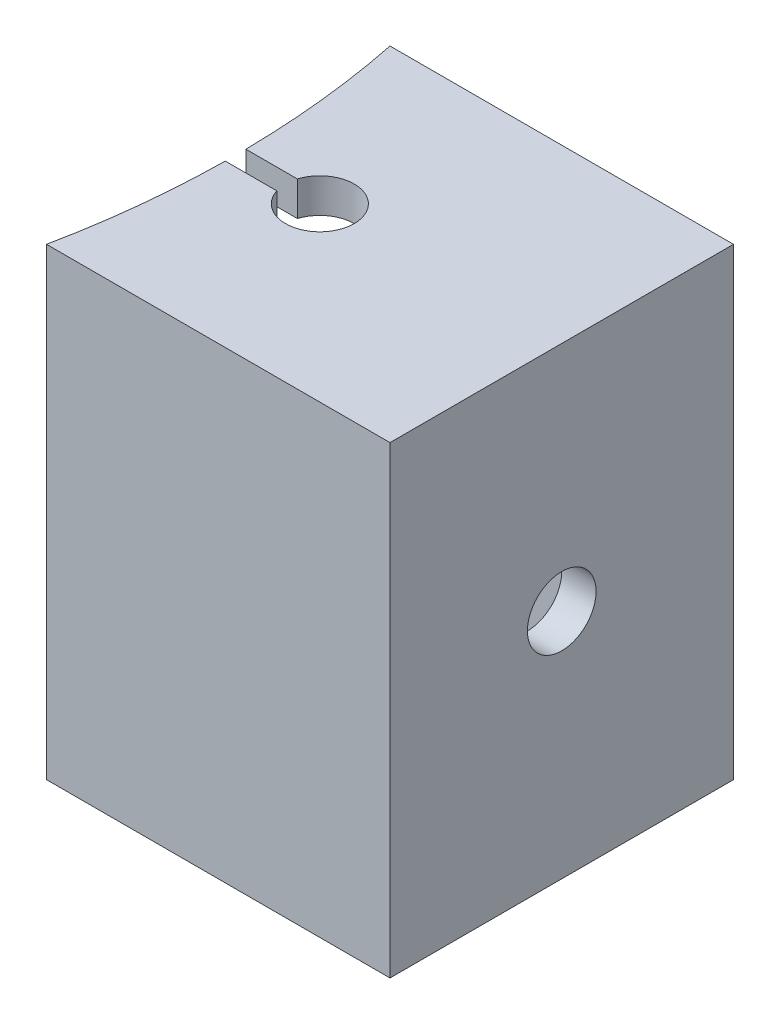
ISO-10303-21;
HEADER;
FILE_DESCRIPTION(('STEP AP214'),'2;1');
FILE_NAME('part.step','',(''),(''),'','','');
FILE_SCHEMA(('AUTOMOTIVE_DESIGN { 1 0 10303 214 1 1 1 1 }'));
ENDSEC;
DATA;
#1=APPLICATION_CONTEXT('core data for automotive mechanical design processes');
#2=APPLICATION_PROTOCOL_DEFINITION('international standard','automotive_design',2000,#1);
#3=PRODUCT_CONTEXT('',#1,'mechanical');
#4=PRODUCT('Part','Part','',(#3));
#5=PRODUCT_RELATED_PRODUCT_CATEGORY('part','',(#4));
#6=PRODUCT_DEFINITION_FORMATION('','',#4);
#7=PRODUCT_DEFINITION_CONTEXT('part definition',#1,'design');
#8=PRODUCT_DEFINITION('design','',#6,#7);
#9=PRODUCT_DEFINITION_SHAPE('','',#8);
#10=(LENGTH_UNIT() NAMED_UNIT(*) SI_UNIT(.MILLI.,.METRE.));
#11=(NAMED_UNIT(*) PLANE_ANGLE_UNIT() SI_UNIT($,.RADIAN.));
#12=(NAMED_UNIT(*) SI_UNIT($,.STERADIAN.) SOLID_ANGLE_UNIT());
#13=UNCERTAINTY_MEASURE_WITH_UNIT(LENGTH_MEASURE(1.E-05),#10,'distance_accuracy_value','');
#14=(GEOMETRIC_REPRESENTATION_CONTEXT(3) GLOBAL_UNCERTAINTY_ASSIGNED_CONTEXT((#13)) GLOBAL_UNIT_ASSIGNED_CONTEXT((#10,
#11,#12)) REPRESENTATION_CONTEXT('',''));
#15=CARTESIAN_POINT('',(0.,0.,0.));
#16=DIRECTION('',(0.,0.,1.));
#17=DIRECTION('',(1.,0.,0.));
#18=AXIS2_PLACEMENT_3D('',#15,#16,#17);
#19=CARTESIAN_POINT('',(-68.9897948556636,27.,-10.));
#20=DIRECTION('',(0.,-1.,0.));
#21=DIRECTION('',(0.,0.,-1.));
#22=AXIS2_PLACEMENT_3D('',#19,#20,#21);
#23=CYLINDRICAL_SURFACE('',#22,50.);
#24=CARTESIAN_POINT('',(-68.9897948556636,2.,-10.));
#25=DIRECTION('',(0.,-1.,0.));
#26=DIRECTION('',(0.,0.,-1.));
#27=AXIS2_PLACEMENT_3D('',#24,#25,#26);
#28=CIRCLE('',#27,50.);
#29=CARTESIAN_POINT('',(-19.6339441386513,2.,-18.));
#30=VERTEX_POINT('',#29);
#31=CARTESIAN_POINT('',(-18.9933961040139,2.,-10.6000932144618));
#32=VERTEX_POINT('',#31);
#33=EDGE_CURVE('E206',#30,#32,#28,.T.);
#34=ORIENTED_EDGE('',*,*,#33,.F.);
#35=DIRECTION('',(0.,-1.,0.));
#36=VECTOR('',#35,1.);
#37=CARTESIAN_POINT('',(-19.6339441386513,25.,-18.));
#38=LINE('',#37,#36);
#39=CARTESIAN_POINT('',(-19.6339441386513,25.,-18.));
#40=VERTEX_POINT('',#39);
#41=EDGE_CURVE('E278',#40,#30,#38,.T.);
#42=ORIENTED_EDGE('',*,*,#41,.F.);
#43=CARTESIAN_POINT('',(-68.9897948556636,25.,-10.));
#44=DIRECTION('',(0.,-1.,0.));
#45=DIRECTION('',(0.,0.,-1.));
#46=AXIS2_PLACEMENT_3D('',#43,#44,#45);
#47=CIRCLE('',#46,50.);
#48=CARTESIAN_POINT('',(-18.9933961040139,25.,-10.6000932144618));
#49=VERTEX_POINT('',#48);
#50=EDGE_CURVE('E269',#40,#49,#47,.T.);
#51=ORIENTED_EDGE('',*,*,#50,.T.);
#52=DIRECTION('',(0.,-1.,0.));
#53=VECTOR('',#52,1.);
#54=CARTESIAN_POINT('',(-18.9933961040139,27.,-10.6000932144618));
#55=LINE('',#54,#53);
#56=CARTESIAN_POINT('',(-18.9933961040139,27.,-10.6000932144618));
#57=VERTEX_POINT('',#56);
#58=EDGE_CURVE('E179',#57,#49,#55,.T.);
#59=ORIENTED_EDGE('',*,*,#58,.F.);
#60=CARTESIAN_POINT('',(-68.9897948556636,27.,-10.));
#61=DIRECTION('',(0.,-1.,0.));
#62=DIRECTION('',(0.,0.,-1.));
#63=AXIS2_PLACEMENT_3D('',#60,#61,#62);
#64=CIRCLE('',#63,50.);
#65=CARTESIAN_POINT('',(-20.,27.,-20.));
#66=VERTEX_POINT('',#65);
#67=EDGE_CURVE('E189',#66,#57,#64,.T.);
#68=ORIENTED_EDGE('',*,*,#67,.F.);
#69=DIRECTION('',(0.,-1.,0.));
#70=VECTOR('',#69,1.);
#71=CARTESIAN_POINT('',(-20.,27.,-20.));
#72=LINE('',#71,#70);
#73=CARTESIAN_POINT('',(-20.,0.,-20.));
#74=VERTEX_POINT('',#73);
#75=EDGE_CURVE('E43',#66,#74,#72,.T.);
#76=ORIENTED_EDGE('',*,*,#75,.T.);
#77=CARTESIAN_POINT('',(-68.9897948556636,0.,-10.));
#78=DIRECTION('',(0.,-1.,0.));
#79=DIRECTION('',(0.,0.,-1.));
#80=AXIS2_PLACEMENT_3D('',#77,#78,#79);
#81=CIRCLE('',#80,50.);
#82=CARTESIAN_POINT('',(-18.9933961040139,0.,-10.6000932144618));
#83=VERTEX_POINT('',#82);
#84=EDGE_CURVE('E154',#74,#83,#81,.T.);
#85=ORIENTED_EDGE('',*,*,#84,.T.);
#86=EDGE_CURVE('E178',#32,#83,#55,.T.);
#87=ORIENTED_EDGE('',*,*,#86,.F.);
#88=EDGE_LOOP('',(#34,#42,#51,#59,#68,#76,#85,#87));
#89=FACE_BOUND('',#88,.T.);
#90=ADVANCED_FACE('F35',(#89),#23,.F.);
#91=CARTESIAN_POINT('',(-18.9933961040139,27.,-10.6000932144618));
#92=DIRECTION('',(0.,0.,-1.));
#93=DIRECTION('',(-1.,0.,0.));
#94=AXIS2_PLACEMENT_3D('',#91,#92,#93);
#95=PLANE('',#94);
#96=DIRECTION('',(1.,0.,0.));
#97=VECTOR('',#96,1.);
#98=CARTESIAN_POINT('',(-68.9897948556636,2.,-10.6000932144618));
#99=LINE('',#98,#97);
#100=CARTESIAN_POINT('',(-15.9933961040139,2.,-10.6000932144618));
#101=VERTEX_POINT('',#100);
#102=EDGE_CURVE('E202',#32,#101,#99,.T.);
#103=ORIENTED_EDGE('',*,*,#102,.F.);
#104=ORIENTED_EDGE('',*,*,#86,.T.);
#105=DIRECTION('',(1.,0.,0.));
#106=VECTOR('',#105,1.);
#107=CARTESIAN_POINT('',(-18.9933961040139,0.,-10.6000932144618));
#108=LINE('',#107,#106);
#109=CARTESIAN_POINT('',(-15.9933961040139,0.,-10.6000932144618));
#110=VERTEX_POINT('',#109);
#111=EDGE_CURVE('E157',#83,#110,#108,.T.);
#112=ORIENTED_EDGE('',*,*,#111,.T.);
#113=DIRECTION('',(0.,-1.,0.));
#114=VECTOR('',#113,1.);
#115=CARTESIAN_POINT('',(-15.9933961040139,27.,-10.6000932144618));
#116=LINE('',#115,#114);
#117=EDGE_CURVE('E174',#101,#110,#116,.T.);
#118=ORIENTED_EDGE('',*,*,#117,.F.);
#119=EDGE_LOOP('',(#103,#104,#112,#118));
#120=FACE_BOUND('',#119,.T.);
#121=ADVANCED_FACE('F198',(#120),#95,.F.);
#122=CARTESIAN_POINT('',(-14.0855165825296,27.,-10.0000967715551));
#123=DIRECTION('',(0.,-1.,0.));
#124=DIRECTION('',(0.,0.,-1.));
#125=AXIS2_PLACEMENT_3D('',#122,#123,#124);
#126=CYLINDRICAL_SURFACE('',#125,2.);
#127=CARTESIAN_POINT('',(-14.0855165825296,2.,-10.0000967715551));
#128=DIRECTION('',(0.,-1.,0.));
#129=DIRECTION('',(0.,0.,-1.));
#130=AXIS2_PLACEMENT_3D('',#127,#128,#129);
#131=CIRCLE('',#130,2.);
#132=CARTESIAN_POINT('',(-15.9933938667057,2.,-9.40009321446183));
#133=VERTEX_POINT('',#132);
#134=EDGE_CURVE('E282',#101,#133,#131,.T.);
#135=ORIENTED_EDGE('',*,*,#134,.F.);
#136=ORIENTED_EDGE('',*,*,#117,.T.);
#137=CARTESIAN_POINT('',(-14.0855165825296,0.,-10.0000967715551));
#138=DIRECTION('',(0.,-1.,0.));
#139=DIRECTION('',(0.,0.,-1.));
#140=AXIS2_PLACEMENT_3D('',#137,#138,#139);
#141=CIRCLE('',#140,2.);
#142=CARTESIAN_POINT('',(-15.9933938667057,0.,-9.40009321446183));
#143=VERTEX_POINT('',#142);
#144=EDGE_CURVE('E160',#110,#143,#141,.T.);
#145=ORIENTED_EDGE('',*,*,#144,.T.);
#146=DIRECTION('',(0.,-1.,0.));
#147=VECTOR('',#146,1.);
#148=CARTESIAN_POINT('',(-15.9933938667057,27.,-9.40009321446183));
#149=LINE('',#148,#147);
#150=EDGE_CURVE('E137',#133,#143,#149,.T.);
#151=ORIENTED_EDGE('',*,*,#150,.F.);
#152=EDGE_LOOP('',(#135,#136,#145,#151));
#153=FACE_BOUND('',#152,.T.);
#154=ADVANCED_FACE('F328',(#153),#126,.F.);
#155=CARTESIAN_POINT('',(-18.9933938667057,27.,-9.40009321446182));
#156=DIRECTION('',(0.,0.,1.));
#157=DIRECTION('',(1.,0.,0.));
#158=AXIS2_PLACEMENT_3D('',#155,#156,#157);
#159=PLANE('',#158);
#160=DIRECTION('',(-1.,0.,0.));
#161=VECTOR('',#160,1.);
#162=CARTESIAN_POINT('',(-68.9897948556636,2.,-9.4000932144618));
#163=LINE('',#162,#161);
#164=CARTESIAN_POINT('',(-18.9933938667057,2.,-9.40009321446182));
#165=VERTEX_POINT('',#164);
#166=EDGE_CURVE('E284',#133,#165,#163,.T.);
#167=ORIENTED_EDGE('',*,*,#166,.F.);
#168=ORIENTED_EDGE('',*,*,#150,.T.);
#169=DIRECTION('',(-1.,0.,0.));
#170=VECTOR('',#169,1.);
#171=CARTESIAN_POINT('',(-18.9933938667057,0.,-9.40009321446182));
#172=LINE('',#171,#170);
#173=CARTESIAN_POINT('',(-18.9933938667057,0.,-9.40009321446182));
#174=VERTEX_POINT('',#173);
#175=EDGE_CURVE('E163',#143,#174,#172,.T.);
#176=ORIENTED_EDGE('',*,*,#175,.T.);
#177=DIRECTION('',(0.,-1.,0.));
#178=VECTOR('',#177,1.);
#179=CARTESIAN_POINT('',(-18.9933938667057,27.,-9.40009321446182));
#180=LINE('',#179,#178);
#181=EDGE_CURVE('E138',#165,#174,#180,.T.);
#182=ORIENTED_EDGE('',*,*,#181,.F.);
#183=EDGE_LOOP('',(#167,#168,#176,#182));
#184=FACE_BOUND('',#183,.T.);
#185=ADVANCED_FACE('F308',(#184),#159,.F.);
#186=CARTESIAN_POINT('',(-68.9897948556636,27.,-10.));
#187=DIRECTION('',(0.,-1.,0.));
#188=DIRECTION('',(0.,0.,-1.));
#189=AXIS2_PLACEMENT_3D('',#186,#187,#188);
#190=CYLINDRICAL_SURFACE('',#189,50.);
#191=CARTESIAN_POINT('',(-68.9897948556636,2.,-10.));
#192=DIRECTION('',(0.,-1.,0.));
#193=DIRECTION('',(0.,0.,-1.));
#194=AXIS2_PLACEMENT_3D('',#191,#192,#193);
#195=CIRCLE('',#194,50.);
#196=CARTESIAN_POINT('',(-19.6339441386513,2.,-2.));
#197=VERTEX_POINT('',#196);
#198=EDGE_CURVE('E271',#165,#197,#195,.T.);
#199=ORIENTED_EDGE('',*,*,#198,.F.);
#200=ORIENTED_EDGE('',*,*,#181,.T.);
#201=CARTESIAN_POINT('',(-68.9897948556636,0.,-10.));
#202=DIRECTION('',(0.,-1.,0.));
#203=DIRECTION('',(0.,0.,-1.));
#204=AXIS2_PLACEMENT_3D('',#201,#202,#203);
#205=CIRCLE('',#204,50.);
#206=CARTESIAN_POINT('',(-20.,0.,0.));
#207=VERTEX_POINT('',#206);
#208=EDGE_CURVE('E166',#174,#207,#205,.T.);
#209=ORIENTED_EDGE('',*,*,#208,.T.);
#210=DIRECTION('',(0.,-1.,0.));
#211=VECTOR('',#210,1.);
#212=CARTESIAN_POINT('',(-20.,27.,0.));
#213=LINE('',#212,#211);
#214=CARTESIAN_POINT('',(-20.,27.,0.));
#215=VERTEX_POINT('',#214);
#216=EDGE_CURVE('E142',#215,#207,#213,.T.);
#217=ORIENTED_EDGE('',*,*,#216,.F.);
#218=CARTESIAN_POINT('',(-68.9897948556636,27.,-10.));
#219=DIRECTION('',(0.,-1.,0.));
#220=DIRECTION('',(0.,0.,-1.));
#221=AXIS2_PLACEMENT_3D('',#218,#219,#220);
#222=CIRCLE('',#221,50.);
#223=CARTESIAN_POINT('',(-18.9933938667057,27.,-9.40009321446182));
#224=VERTEX_POINT('',#223);
#225=EDGE_CURVE('E120',#224,#215,#222,.T.);
#226=ORIENTED_EDGE('',*,*,#225,.F.);
#227=CARTESIAN_POINT('',(-18.9933938667057,25.,-9.40009321446182));
#228=VERTEX_POINT('',#227);
#229=EDGE_CURVE('E130',#224,#228,#180,.T.);
#230=ORIENTED_EDGE('',*,*,#229,.T.);
#231=CARTESIAN_POINT('',(-68.9897948556636,25.,-10.));
#232=DIRECTION('',(0.,-1.,0.));
#233=DIRECTION('',(0.,0.,-1.));
#234=AXIS2_PLACEMENT_3D('',#231,#232,#233);
#235=CIRCLE('',#234,50.);
#236=CARTESIAN_POINT('',(-19.6339441386513,25.,-2.));
#237=VERTEX_POINT('',#236);
#238=EDGE_CURVE('E257',#228,#237,#235,.T.);
#239=ORIENTED_EDGE('',*,*,#238,.T.);
#240=DIRECTION('',(0.,-1.,0.));
#241=VECTOR('',#240,1.);
#242=CARTESIAN_POINT('',(-19.6339441386513,25.,-2.));
#243=LINE('',#242,#241);
#244=EDGE_CURVE('E256',#237,#197,#243,.T.);
#245=ORIENTED_EDGE('',*,*,#244,.T.);
#246=EDGE_LOOP('',(#199,#200,#209,#217,#226,#230,#239,#245));
#247=FACE_BOUND('',#246,.T.);
#248=ADVANCED_FACE('F141',(#247),#190,.F.);
#249=CARTESIAN_POINT('',(0.,27.,0.));
#250=DIRECTION('',(-1.,0.,0.));
#251=DIRECTION('',(0.,0.,1.));
#252=AXIS2_PLACEMENT_3D('',#249,#250,#251);
#253=PLANE('',#252);
#254=CARTESIAN_POINT('',(0.,13.5,-10.));
#255=DIRECTION('',(1.,0.,0.));
#256=DIRECTION('',(0.,0.,-1.));
#257=AXIS2_PLACEMENT_3D('',#254,#255,#256);
#258=CIRCLE('',#257,2.);
#259=CARTESIAN_POINT('',(0.,13.5,-12.));
#260=VERTEX_POINT('',#259);
#261=EDGE_CURVE('E366',#260,#260,#258,.T.);
#262=ORIENTED_EDGE('',*,*,#261,.F.);
#263=EDGE_LOOP('',(#262));
#264=FACE_BOUND('',#263,.T.);
#265=DIRECTION('',(0.,0.,-1.));
#266=VECTOR('',#265,1.);
#267=CARTESIAN_POINT('',(0.,0.,0.));
#268=LINE('',#267,#266);
#269=CARTESIAN_POINT('',(0.,0.,0.));
#270=VERTEX_POINT('',#269);
#271=CARTESIAN_POINT('',(0.,0.,-20.));
#272=VERTEX_POINT('',#271);
#273=EDGE_CURVE('E148',#270,#272,#268,.T.);
#274=ORIENTED_EDGE('',*,*,#273,.T.);
#275=DIRECTION('',(0.,-1.,0.));
#276=VECTOR('',#275,1.);
#277=CARTESIAN_POINT('',(0.,27.,-20.));
#278=LINE('',#277,#276);
#279=CARTESIAN_POINT('',(0.,27.,-20.));
#280=VERTEX_POINT('',#279);
#281=EDGE_CURVE('E11',#280,#272,#278,.T.);
#282=ORIENTED_EDGE('',*,*,#281,.F.);
#283=DIRECTION('',(0.,0.,-1.));
#284=VECTOR('',#283,1.);
#285=CARTESIAN_POINT('',(0.,27.,0.));
#286=LINE('',#285,#284);
#287=CARTESIAN_POINT('',(0.,27.,0.));
#288=VERTEX_POINT('',#287);
#289=EDGE_CURVE('E169',#288,#280,#286,.T.);
#290=ORIENTED_EDGE('',*,*,#289,.F.);
#291=DIRECTION('',(0.,-1.,0.));
#292=VECTOR('',#291,1.);
#293=CARTESIAN_POINT('',(0.,27.,0.));
#294=LINE('',#293,#292);
#295=EDGE_CURVE('E144',#288,#270,#294,.T.);
#296=ORIENTED_EDGE('',*,*,#295,.T.);
#297=EDGE_LOOP('',(#274,#282,#290,#296));
#298=FACE_BOUND('',#297,.T.);
#299=ADVANCED_FACE('F37',(#264,#298),#253,.F.);
#300=CARTESIAN_POINT('',(0.,27.,-20.));
#301=DIRECTION('',(0.,0.,1.));
#302=DIRECTION('',(1.,0.,0.));
#303=AXIS2_PLACEMENT_3D('',#300,#301,#302);
#304=PLANE('',#303);
#305=DIRECTION('',(-1.,0.,0.));
#306=VECTOR('',#305,1.);
#307=CARTESIAN_POINT('',(0.,0.,-20.));
#308=LINE('',#307,#306);
#309=EDGE_CURVE('E151',#272,#74,#308,.T.);
#310=ORIENTED_EDGE('',*,*,#309,.T.);
#311=ORIENTED_EDGE('',*,*,#75,.F.);
#312=DIRECTION('',(-1.,0.,0.));
#313=VECTOR('',#312,1.);
#314=CARTESIAN_POINT('',(0.,27.,-20.));
#315=LINE('',#314,#313);
#316=EDGE_CURVE('E100',#280,#66,#315,.T.);
#317=ORIENTED_EDGE('',*,*,#316,.F.);
#318=ORIENTED_EDGE('',*,*,#281,.T.);
#319=EDGE_LOOP('',(#310,#311,#317,#318));
#320=FACE_BOUND('',#319,.T.);
#321=ADVANCED_FACE('F315',(#320),#304,.F.);
#322=ORIENTED_EDGE('',*,*,#58,.T.);
#323=DIRECTION('',(1.,0.,0.));
#324=VECTOR('',#323,1.);
#325=CARTESIAN_POINT('',(-68.9897948556636,25.,-10.6000932144618));
#326=LINE('',#325,#324);
#327=CARTESIAN_POINT('',(-15.9933961040139,25.,-10.6000932144618));
#328=VERTEX_POINT('',#327);
#329=EDGE_CURVE('E234',#49,#328,#326,.T.);
#330=ORIENTED_EDGE('',*,*,#329,.T.);
#331=CARTESIAN_POINT('',(-15.9933961040139,27.,-10.6000932144618));
#332=VERTEX_POINT('',#331);
#333=EDGE_CURVE('E175',#332,#328,#116,.T.);
#334=ORIENTED_EDGE('',*,*,#333,.F.);
#335=DIRECTION('',(1.,0.,0.));
#336=VECTOR('',#335,1.);
#337=CARTESIAN_POINT('',(-18.9933961040139,27.,-10.6000932144618));
#338=LINE('',#337,#336);
#339=EDGE_CURVE('E298',#57,#332,#338,.T.);
#340=ORIENTED_EDGE('',*,*,#339,.F.);
#341=EDGE_LOOP('',(#322,#330,#334,#340));
#342=FACE_BOUND('',#341,.T.);
#343=ADVANCED_FACE('F302',(#342),#95,.F.);
#344=ORIENTED_EDGE('',*,*,#333,.T.);
#345=CARTESIAN_POINT('',(-14.0855165825296,25.,-10.0000967715551));
#346=DIRECTION('',(0.,-1.,0.));
#347=DIRECTION('',(0.,0.,-1.));
#348=AXIS2_PLACEMENT_3D('',#345,#346,#347);
#349=CIRCLE('',#348,2.);
#350=CARTESIAN_POINT('',(-15.9933938667057,25.,-9.40009321446183));
#351=VERTEX_POINT('',#350);
#352=EDGE_CURVE('E290',#328,#351,#349,.T.);
#353=ORIENTED_EDGE('',*,*,#352,.T.);
#354=CARTESIAN_POINT('',(-15.9933938667057,27.,-9.40009321446183));
#355=VERTEX_POINT('',#354);
#356=EDGE_CURVE('E172',#355,#351,#149,.T.);
#357=ORIENTED_EDGE('',*,*,#356,.F.);
#358=CARTESIAN_POINT('',(-14.0855165825296,27.,-10.0000967715551));
#359=DIRECTION('',(0.,-1.,0.));
#360=DIRECTION('',(0.,0.,-1.));
#361=AXIS2_PLACEMENT_3D('',#358,#359,#360);
#362=CIRCLE('',#361,2.);
#363=EDGE_CURVE('E123',#332,#355,#362,.T.);
#364=ORIENTED_EDGE('',*,*,#363,.F.);
#365=EDGE_LOOP('',(#344,#353,#357,#364));
#366=FACE_BOUND('',#365,.T.);
#367=ADVANCED_FACE('F304',(#366),#126,.F.);
#368=ORIENTED_EDGE('',*,*,#356,.T.);
#369=DIRECTION('',(-1.,0.,0.));
#370=VECTOR('',#369,1.);
#371=CARTESIAN_POINT('',(-68.9897948556636,25.,-9.4000932144618));
#372=LINE('',#371,#370);
#373=EDGE_CURVE('E134',#351,#228,#372,.T.);
#374=ORIENTED_EDGE('',*,*,#373,.T.);
#375=ORIENTED_EDGE('',*,*,#229,.F.);
#376=DIRECTION('',(-1.,0.,0.));
#377=VECTOR('',#376,1.);
#378=CARTESIAN_POINT('',(-18.9933938667057,27.,-9.40009321446182));
#379=LINE('',#378,#377);
#380=EDGE_CURVE('E116',#355,#224,#379,.T.);
#381=ORIENTED_EDGE('',*,*,#380,.F.);
#382=EDGE_LOOP('',(#368,#374,#375,#381));
#383=FACE_BOUND('',#382,.T.);
#384=ADVANCED_FACE('F131',(#383),#159,.F.);
#385=CARTESIAN_POINT('',(0.,27.,0.));
#386=DIRECTION('',(0.,0.,-1.));
#387=DIRECTION('',(-1.,0.,0.));
#388=AXIS2_PLACEMENT_3D('',#385,#386,#387);
#389=PLANE('',#388);
#390=DIRECTION('',(1.,0.,0.));
#391=VECTOR('',#390,1.);
#392=CARTESIAN_POINT('',(0.,0.,0.));
#393=LINE('',#392,#391);
#394=EDGE_CURVE('E92',#207,#270,#393,.T.);
#395=ORIENTED_EDGE('',*,*,#394,.T.);
#396=ORIENTED_EDGE('',*,*,#295,.F.);
#397=DIRECTION('',(1.,0.,0.));
#398=VECTOR('',#397,1.);
#399=CARTESIAN_POINT('',(0.,27.,0.));
#400=LINE('',#399,#398);
#401=EDGE_CURVE('E59',#215,#288,#400,.T.);
#402=ORIENTED_EDGE('',*,*,#401,.F.);
#403=ORIENTED_EDGE('',*,*,#216,.T.);
#404=EDGE_LOOP('',(#395,#396,#402,#403));
#405=FACE_BOUND('',#404,.T.);
#406=ADVANCED_FACE('F311',(#405),#389,.F.);
#407=CARTESIAN_POINT('',(-68.9897948556636,27.,-10.));
#408=DIRECTION('',(0.,-1.,0.));
#409=DIRECTION('',(0.,0.,-1.));
#410=AXIS2_PLACEMENT_3D('',#407,#408,#409);
#411=PLANE('',#410);
#412=ORIENTED_EDGE('',*,*,#289,.T.);
#413=ORIENTED_EDGE('',*,*,#316,.T.);
#414=ORIENTED_EDGE('',*,*,#67,.T.);
#415=ORIENTED_EDGE('',*,*,#339,.T.);
#416=ORIENTED_EDGE('',*,*,#363,.T.);
#417=ORIENTED_EDGE('',*,*,#380,.T.);
#418=ORIENTED_EDGE('',*,*,#225,.T.);
#419=ORIENTED_EDGE('',*,*,#401,.T.);
#420=EDGE_LOOP('',(#412,#413,#414,#415,#416,#417,#418,#419));
#421=FACE_BOUND('',#420,.T.);
#422=ADVANCED_FACE('F118',(#421),#411,.F.);
#423=CARTESIAN_POINT('',(-68.9897948556636,0.,-10.));
#424=DIRECTION('',(0.,-1.,0.));
#425=DIRECTION('',(0.,0.,-1.));
#426=AXIS2_PLACEMENT_3D('',#423,#424,#425);
#427=PLANE('',#426);
#428=ORIENTED_EDGE('',*,*,#273,.F.);
#429=ORIENTED_EDGE('',*,*,#394,.F.);
#430=ORIENTED_EDGE('',*,*,#208,.F.);
#431=ORIENTED_EDGE('',*,*,#175,.F.);
#432=ORIENTED_EDGE('',*,*,#144,.F.);
#433=ORIENTED_EDGE('',*,*,#111,.F.);
#434=ORIENTED_EDGE('',*,*,#84,.F.);
#435=ORIENTED_EDGE('',*,*,#309,.F.);
#436=EDGE_LOOP('',(#428,#429,#430,#431,#432,#433,#434,#435));
#437=FACE_BOUND('',#436,.T.);
#438=ADVANCED_FACE('F192',(#437),#427,.T.);
#439=CARTESIAN_POINT('',(-2.,27.,0.));
#440=DIRECTION('',(-1.,0.,0.));
#441=DIRECTION('',(0.,0.,1.));
#442=AXIS2_PLACEMENT_3D('',#439,#440,#441);
#443=PLANE('',#442);
#444=CARTESIAN_POINT('',(-2.,13.5,-10.));
#445=DIRECTION('',(1.,0.,0.));
#446=DIRECTION('',(0.,0.,-1.));
#447=AXIS2_PLACEMENT_3D('',#444,#445,#446);
#448=CIRCLE('',#447,2.);
#449=CARTESIAN_POINT('',(-2.,13.5,-12.));
#450=VERTEX_POINT('',#449);
#451=EDGE_CURVE('E363',#450,#450,#448,.T.);
#452=ORIENTED_EDGE('',*,*,#451,.T.);
#453=EDGE_LOOP('',(#452));
#454=FACE_BOUND('',#453,.T.);
#455=DIRECTION('',(0.,0.,-1.));
#456=VECTOR('',#455,1.);
#457=CARTESIAN_POINT('',(-2.,2.,-10.));
#458=LINE('',#457,#456);
#459=CARTESIAN_POINT('',(-2.,2.,-2.));
#460=VERTEX_POINT('',#459);
#461=CARTESIAN_POINT('',(-2.,2.,-18.));
#462=VERTEX_POINT('',#461);
#463=EDGE_CURVE('E264',#460,#462,#458,.T.);
#464=ORIENTED_EDGE('',*,*,#463,.F.);
#465=DIRECTION('',(0.,-1.,0.));
#466=VECTOR('',#465,1.);
#467=CARTESIAN_POINT('',(-2.,27.,-2.));
#468=LINE('',#467,#466);
#469=CARTESIAN_POINT('',(-2.,25.,-2.));
#470=VERTEX_POINT('',#469);
#471=EDGE_CURVE('E253',#470,#460,#468,.T.);
#472=ORIENTED_EDGE('',*,*,#471,.F.);
#473=DIRECTION('',(0.,0.,-1.));
#474=VECTOR('',#473,1.);
#475=CARTESIAN_POINT('',(-2.,25.,-10.));
#476=LINE('',#475,#474);
#477=CARTESIAN_POINT('',(-2.,25.,-18.));
#478=VERTEX_POINT('',#477);
#479=EDGE_CURVE('E262',#470,#478,#476,.T.);
#480=ORIENTED_EDGE('',*,*,#479,.T.);
#481=DIRECTION('',(0.,-1.,0.));
#482=VECTOR('',#481,1.);
#483=CARTESIAN_POINT('',(-2.,27.,-18.));
#484=LINE('',#483,#482);
#485=EDGE_CURVE('E152',#478,#462,#484,.T.);
#486=ORIENTED_EDGE('',*,*,#485,.T.);
#487=EDGE_LOOP('',(#464,#472,#480,#486));
#488=FACE_BOUND('',#487,.T.);
#489=ADVANCED_FACE('F260',(#454,#488),#443,.T.);
#490=CARTESIAN_POINT('',(0.,27.,-18.));
#491=DIRECTION('',(0.,0.,1.));
#492=DIRECTION('',(1.,0.,0.));
#493=AXIS2_PLACEMENT_3D('',#490,#491,#492);
#494=PLANE('',#493);
#495=DIRECTION('',(-1.,0.,0.));
#496=VECTOR('',#495,1.);
#497=CARTESIAN_POINT('',(-68.9897948556636,2.,-18.));
#498=LINE('',#497,#496);
#499=EDGE_CURVE('E276',#462,#30,#498,.T.);
#500=ORIENTED_EDGE('',*,*,#499,.F.);
#501=ORIENTED_EDGE('',*,*,#485,.F.);
#502=DIRECTION('',(-1.,0.,0.));
#503=VECTOR('',#502,1.);
#504=CARTESIAN_POINT('',(-68.9897948556636,25.,-18.));
#505=LINE('',#504,#503);
#506=EDGE_CURVE('E242',#478,#40,#505,.T.);
#507=ORIENTED_EDGE('',*,*,#506,.T.);
#508=ORIENTED_EDGE('',*,*,#41,.T.);
#509=EDGE_LOOP('',(#500,#501,#507,#508));
#510=FACE_BOUND('',#509,.T.);
#511=ADVANCED_FACE('F350',(#510),#494,.T.);
#512=CARTESIAN_POINT('',(0.,27.,-2.));
#513=DIRECTION('',(0.,0.,-1.));
#514=DIRECTION('',(-1.,0.,0.));
#515=AXIS2_PLACEMENT_3D('',#512,#513,#514);
#516=PLANE('',#515);
#517=DIRECTION('',(1.,0.,0.));
#518=VECTOR('',#517,1.);
#519=CARTESIAN_POINT('',(-68.9897948556636,2.,-1.99999999999999));
#520=LINE('',#519,#518);
#521=EDGE_CURVE('E267',#197,#460,#520,.T.);
#522=ORIENTED_EDGE('',*,*,#521,.F.);
#523=ORIENTED_EDGE('',*,*,#244,.F.);
#524=DIRECTION('',(1.,0.,0.));
#525=VECTOR('',#524,1.);
#526=CARTESIAN_POINT('',(-68.9897948556636,25.,-1.99999999999999));
#527=LINE('',#526,#525);
#528=EDGE_CURVE('E50',#237,#470,#527,.T.);
#529=ORIENTED_EDGE('',*,*,#528,.T.);
#530=ORIENTED_EDGE('',*,*,#471,.T.);
#531=EDGE_LOOP('',(#522,#523,#529,#530));
#532=FACE_BOUND('',#531,.T.);
#533=ADVANCED_FACE('F252',(#532),#516,.T.);
#534=CARTESIAN_POINT('',(-68.9897948556636,25.,-10.));
#535=DIRECTION('',(0.,-1.,0.));
#536=DIRECTION('',(0.,0.,-1.));
#537=AXIS2_PLACEMENT_3D('',#534,#535,#536);
#538=PLANE('',#537);
#539=ORIENTED_EDGE('',*,*,#479,.F.);
#540=ORIENTED_EDGE('',*,*,#528,.F.);
#541=ORIENTED_EDGE('',*,*,#238,.F.);
#542=ORIENTED_EDGE('',*,*,#373,.F.);
#543=ORIENTED_EDGE('',*,*,#352,.F.);
#544=ORIENTED_EDGE('',*,*,#329,.F.);
#545=ORIENTED_EDGE('',*,*,#50,.F.);
#546=ORIENTED_EDGE('',*,*,#506,.F.);
#547=EDGE_LOOP('',(#539,#540,#541,#542,#543,#544,#545,#546));
#548=FACE_BOUND('',#547,.T.);
#549=ADVANCED_FACE('F266',(#548),#538,.T.);
#550=CARTESIAN_POINT('',(-68.9897948556636,2.,-10.));
#551=DIRECTION('',(0.,-1.,0.));
#552=DIRECTION('',(0.,0.,-1.));
#553=AXIS2_PLACEMENT_3D('',#550,#551,#552);
#554=PLANE('',#553);
#555=ORIENTED_EDGE('',*,*,#463,.T.);
#556=ORIENTED_EDGE('',*,*,#499,.T.);
#557=ORIENTED_EDGE('',*,*,#33,.T.);
#558=ORIENTED_EDGE('',*,*,#102,.T.);
#559=ORIENTED_EDGE('',*,*,#134,.T.);
#560=ORIENTED_EDGE('',*,*,#166,.T.);
#561=ORIENTED_EDGE('',*,*,#198,.T.);
#562=ORIENTED_EDGE('',*,*,#521,.T.);
#563=EDGE_LOOP('',(#555,#556,#557,#558,#559,#560,#561,#562));
#564=FACE_BOUND('',#563,.T.);
#565=ADVANCED_FACE('F342',(#564),#554,.F.);
#566=CARTESIAN_POINT('',(-2.,13.5,-10.));
#567=DIRECTION('',(1.,0.,0.));
#568=DIRECTION('',(0.,0.,-1.));
#569=AXIS2_PLACEMENT_3D('',#566,#567,#568);
#570=CYLINDRICAL_SURFACE('',#569,2.);
#571=ORIENTED_EDGE('',*,*,#451,.F.);
#572=EDGE_LOOP('',(#571));
#573=FACE_BOUND('',#572,.T.);
#574=ORIENTED_EDGE('',*,*,#261,.T.);
#575=EDGE_LOOP('',(#574));
#576=FACE_BOUND('',#575,.T.);
#577=ADVANCED_FACE('F345',(#573,#576),#570,.F.);
#578=CLOSED_SHELL('',(#90,#121,#154,#185,#248,#299,#321,#343,#367,#384,#406,#422,#438,#489,#511,
#533,#549,#565,#577));
#579=MANIFOLD_SOLID_BREP('B2',#578);
#580=ADVANCED_BREP_SHAPE_REPRESENTATION('',(#18,#579),#14);
#581=SHAPE_DEFINITION_REPRESENTATION(#9,#580);
ENDSEC;
END-ISO-10303-21;
